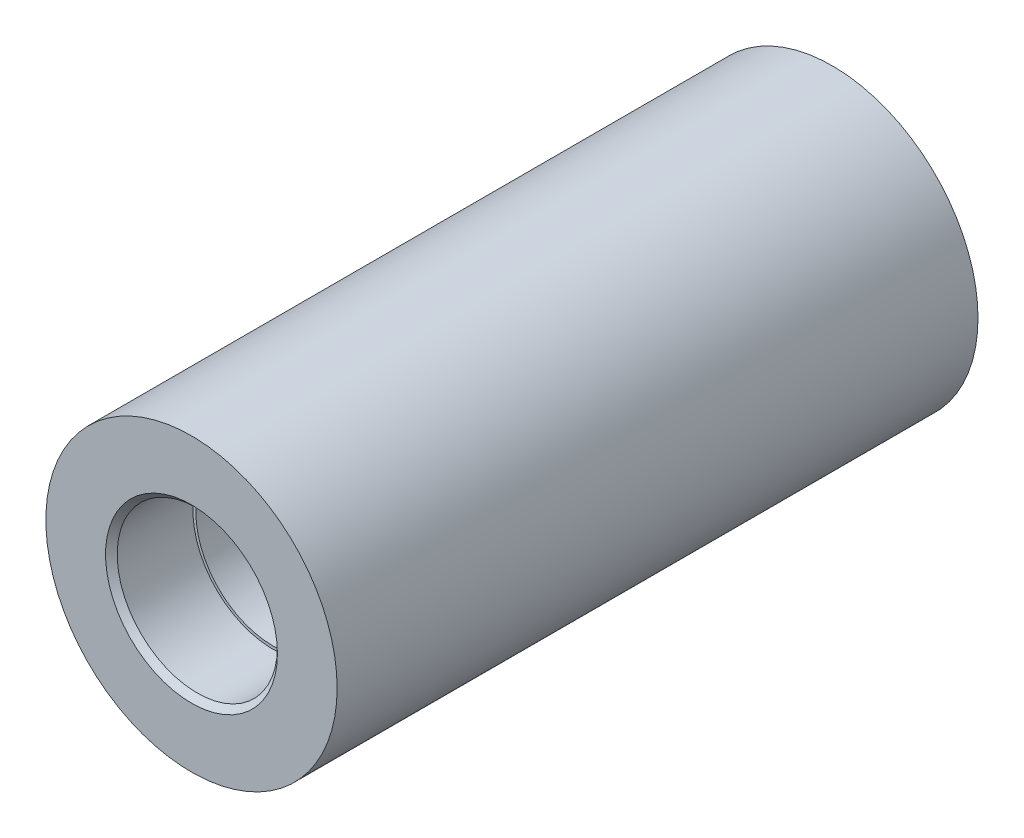
ISO-10303-21;
HEADER;
FILE_DESCRIPTION(('STEP AP214'),'2;1');
FILE_NAME('part.step','',(''),(''),'','','');
FILE_SCHEMA(('AUTOMOTIVE_DESIGN { 1 0 10303 214 1 1 1 1 }'));
ENDSEC;
DATA;
#1=APPLICATION_CONTEXT('core data for automotive mechanical design processes');
#2=APPLICATION_PROTOCOL_DEFINITION('international standard','automotive_design',2000,#1);
#3=PRODUCT_CONTEXT('',#1,'mechanical');
#4=PRODUCT('Part','Part','',(#3));
#5=PRODUCT_RELATED_PRODUCT_CATEGORY('part','',(#4));
#6=PRODUCT_DEFINITION_FORMATION('','',#4);
#7=PRODUCT_DEFINITION_CONTEXT('part definition',#1,'design');
#8=PRODUCT_DEFINITION('design','',#6,#7);
#9=PRODUCT_DEFINITION_SHAPE('','',#8);
#10=(LENGTH_UNIT() NAMED_UNIT(*) SI_UNIT(.MILLI.,.METRE.));
#11=(NAMED_UNIT(*) PLANE_ANGLE_UNIT() SI_UNIT($,.RADIAN.));
#12=(NAMED_UNIT(*) SI_UNIT($,.STERADIAN.) SOLID_ANGLE_UNIT());
#13=UNCERTAINTY_MEASURE_WITH_UNIT(LENGTH_MEASURE(1.E-05),#10,'distance_accuracy_value','');
#14=(GEOMETRIC_REPRESENTATION_CONTEXT(3) GLOBAL_UNCERTAINTY_ASSIGNED_CONTEXT((#13)) GLOBAL_UNIT_ASSIGNED_CONTEXT((#10,
#11,#12)) REPRESENTATION_CONTEXT('',''));
#15=CARTESIAN_POINT('',(0.,0.,0.));
#16=DIRECTION('',(0.,0.,1.));
#17=DIRECTION('',(1.,0.,0.));
#18=AXIS2_PLACEMENT_3D('',#15,#16,#17);
#19=CARTESIAN_POINT('',(0.,0.,44.));
#20=DIRECTION('',(0.,0.,-1.));
#21=DIRECTION('',(-1.,0.,0.));
#22=AXIS2_PLACEMENT_3D('',#19,#20,#21);
#23=CYLINDRICAL_SURFACE('',#22,5.3);
#24=CARTESIAN_POINT('',(0.,0.,38.4));
#25=DIRECTION('',(0.,0.,1.));
#26=DIRECTION('',(1.,0.,0.));
#27=AXIS2_PLACEMENT_3D('',#24,#25,#26);
#28=CIRCLE('',#27,5.3);
#29=CARTESIAN_POINT('',(5.3,0.,38.4));
#30=VERTEX_POINT('',#29);
#31=EDGE_CURVE('E64',#30,#30,#28,.T.);
#32=ORIENTED_EDGE('',*,*,#31,.T.);
#33=EDGE_LOOP('',(#32));
#34=FACE_BOUND('',#33,.T.);
#35=CARTESIAN_POINT('',(0.,0.,5.6));
#36=DIRECTION('',(0.,0.,-1.));
#37=DIRECTION('',(-1.,0.,0.));
#38=AXIS2_PLACEMENT_3D('',#35,#36,#37);
#39=CIRCLE('',#38,5.3);
#40=CARTESIAN_POINT('',(-5.3,0.,5.6));
#41=VERTEX_POINT('',#40);
#42=EDGE_CURVE('E59',#41,#41,#39,.T.);
#43=ORIENTED_EDGE('',*,*,#42,.T.);
#44=EDGE_LOOP('',(#43));
#45=FACE_BOUND('',#44,.T.);
#46=ADVANCED_FACE('F37',(#34,#45),#23,.F.);
#47=CARTESIAN_POINT('',(0.,0.,44.));
#48=DIRECTION('',(0.,0.,1.));
#49=DIRECTION('',(1.,0.,0.));
#50=AXIS2_PLACEMENT_3D('',#47,#48,#49);
#51=PLANE('',#50);
#52=CARTESIAN_POINT('',(0.,0.,44.));
#53=DIRECTION('',(0.,0.,1.));
#54=DIRECTION('',(1.,0.,0.));
#55=AXIS2_PLACEMENT_3D('',#52,#53,#54);
#56=CIRCLE('',#55,5.9);
#57=CARTESIAN_POINT('',(5.9,0.,44.));
#58=VERTEX_POINT('',#57);
#59=EDGE_CURVE('E49',#58,#58,#56,.F.);
#60=ORIENTED_EDGE('',*,*,#59,.T.);
#61=EDGE_LOOP('',(#60));
#62=FACE_BOUND('',#61,.T.);
#63=CARTESIAN_POINT('',(0.,0.,44.));
#64=DIRECTION('',(0.,0.,1.));
#65=DIRECTION('',(1.,0.,0.));
#66=AXIS2_PLACEMENT_3D('',#63,#64,#65);
#67=CIRCLE('',#66,10.);
#68=CARTESIAN_POINT('',(10.,0.,44.));
#69=VERTEX_POINT('',#68);
#70=EDGE_CURVE('E58',#69,#69,#67,.T.);
#71=ORIENTED_EDGE('',*,*,#70,.T.);
#72=EDGE_LOOP('',(#71));
#73=FACE_BOUND('',#72,.T.);
#74=ADVANCED_FACE('F94',(#62,#73),#51,.T.);
#75=CARTESIAN_POINT('',(0.,0.,0.));
#76=DIRECTION('',(0.,0.,1.));
#77=DIRECTION('',(1.,0.,0.));
#78=AXIS2_PLACEMENT_3D('',#75,#76,#77);
#79=PLANE('',#78);
#80=CARTESIAN_POINT('',(0.,0.,0.));
#81=DIRECTION('',(0.,0.,1.));
#82=DIRECTION('',(1.,0.,0.));
#83=AXIS2_PLACEMENT_3D('',#80,#81,#82);
#84=CIRCLE('',#83,6.29499885579992);
#85=CARTESIAN_POINT('',(6.29499885579992,0.,0.));
#86=VERTEX_POINT('',#85);
#87=EDGE_CURVE('E10',#86,#86,#84,.T.);
#88=ORIENTED_EDGE('',*,*,#87,.T.);
#89=EDGE_LOOP('',(#88));
#90=FACE_BOUND('',#89,.T.);
#91=CARTESIAN_POINT('',(0.,0.,0.));
#92=DIRECTION('',(0.,0.,1.));
#93=DIRECTION('',(1.,0.,0.));
#94=AXIS2_PLACEMENT_3D('',#91,#92,#93);
#95=CIRCLE('',#94,10.);
#96=CARTESIAN_POINT('',(10.,0.,0.));
#97=VERTEX_POINT('',#96);
#98=EDGE_CURVE('E67',#97,#97,#95,.T.);
#99=ORIENTED_EDGE('',*,*,#98,.F.);
#100=EDGE_LOOP('',(#99));
#101=FACE_BOUND('',#100,.T.);
#102=ADVANCED_FACE('F100',(#90,#101),#79,.F.);
#103=CARTESIAN_POINT('',(0.,0.,44.));
#104=DIRECTION('',(0.,0.,-1.));
#105=DIRECTION('',(-1.,0.,0.));
#106=AXIS2_PLACEMENT_3D('',#103,#104,#105);
#107=CYLINDRICAL_SURFACE('',#106,10.);
#108=ORIENTED_EDGE('',*,*,#70,.F.);
#109=EDGE_LOOP('',(#108));
#110=FACE_BOUND('',#109,.T.);
#111=ORIENTED_EDGE('',*,*,#98,.T.);
#112=EDGE_LOOP('',(#111));
#113=FACE_BOUND('',#112,.T.);
#114=ADVANCED_FACE('F108',(#110,#113),#107,.T.);
#115=CARTESIAN_POINT('',(0.,0.,38.4));
#116=DIRECTION('',(0.,0.,1.));
#117=DIRECTION('',(1.,0.,0.));
#118=AXIS2_PLACEMENT_3D('',#115,#116,#117);
#119=CYLINDRICAL_SURFACE('',#118,5.5);
#120=CARTESIAN_POINT('',(0.,0.,43.6));
#121=DIRECTION('',(0.,0.,1.));
#122=DIRECTION('',(1.,0.,0.));
#123=AXIS2_PLACEMENT_3D('',#120,#121,#122);
#124=CIRCLE('',#123,5.5);
#125=CARTESIAN_POINT('',(5.5,0.,43.6));
#126=VERTEX_POINT('',#125);
#127=EDGE_CURVE('E53',#126,#126,#124,.T.);
#128=ORIENTED_EDGE('',*,*,#127,.T.);
#129=EDGE_LOOP('',(#128));
#130=FACE_BOUND('',#129,.T.);
#131=CARTESIAN_POINT('',(0.,0.,38.4));
#132=DIRECTION('',(0.,0.,1.));
#133=DIRECTION('',(1.,0.,0.));
#134=AXIS2_PLACEMENT_3D('',#131,#132,#133);
#135=CIRCLE('',#134,5.5);
#136=CARTESIAN_POINT('',(5.5,0.,38.4));
#137=VERTEX_POINT('',#136);
#138=EDGE_CURVE('E62',#137,#137,#135,.T.);
#139=ORIENTED_EDGE('',*,*,#138,.F.);
#140=EDGE_LOOP('',(#139));
#141=FACE_BOUND('',#140,.T.);
#142=ADVANCED_FACE('F90',(#130,#141),#119,.F.);
#143=CARTESIAN_POINT('',(0.,0.,38.4));
#144=DIRECTION('',(0.,0.,1.));
#145=DIRECTION('',(1.,0.,0.));
#146=AXIS2_PLACEMENT_3D('',#143,#144,#145);
#147=PLANE('',#146);
#148=ORIENTED_EDGE('',*,*,#31,.F.);
#149=EDGE_LOOP('',(#148));
#150=FACE_BOUND('',#149,.T.);
#151=ORIENTED_EDGE('',*,*,#138,.T.);
#152=EDGE_LOOP('',(#151));
#153=FACE_BOUND('',#152,.T.);
#154=ADVANCED_FACE('F81',(#150,#153),#147,.T.);
#155=CARTESIAN_POINT('',(0.,0.,5.6));
#156=DIRECTION('',(0.,0.,-1.));
#157=DIRECTION('',(-1.,0.,0.));
#158=AXIS2_PLACEMENT_3D('',#155,#156,#157);
#159=CYLINDRICAL_SURFACE('',#158,5.89499885579991);
#160=CARTESIAN_POINT('',(0.,0.,0.400000000000014));
#161=DIRECTION('',(0.,0.,1.));
#162=DIRECTION('',(1.,0.,0.));
#163=AXIS2_PLACEMENT_3D('',#160,#161,#162);
#164=CIRCLE('',#163,5.89499885579991);
#165=CARTESIAN_POINT('',(5.89499885579991,0.,0.400000000000014));
#166=VERTEX_POINT('',#165);
#167=EDGE_CURVE('E45',#166,#166,#164,.F.);
#168=ORIENTED_EDGE('',*,*,#167,.T.);
#169=EDGE_LOOP('',(#168));
#170=FACE_BOUND('',#169,.T.);
#171=CARTESIAN_POINT('',(0.,0.,5.6));
#172=DIRECTION('',(0.,0.,-1.));
#173=DIRECTION('',(-1.,0.,0.));
#174=AXIS2_PLACEMENT_3D('',#171,#172,#173);
#175=CIRCLE('',#174,5.89499885579991);
#176=CARTESIAN_POINT('',(-5.89499885579991,0.,5.6));
#177=VERTEX_POINT('',#176);
#178=EDGE_CURVE('E63',#177,#177,#175,.T.);
#179=ORIENTED_EDGE('',*,*,#178,.F.);
#180=EDGE_LOOP('',(#179));
#181=FACE_BOUND('',#180,.T.);
#182=ADVANCED_FACE('F79',(#170,#181),#159,.F.);
#183=CARTESIAN_POINT('',(0.,0.,5.6));
#184=DIRECTION('',(0.,0.,-1.));
#185=DIRECTION('',(-1.,0.,0.));
#186=AXIS2_PLACEMENT_3D('',#183,#184,#185);
#187=PLANE('',#186);
#188=ORIENTED_EDGE('',*,*,#42,.F.);
#189=EDGE_LOOP('',(#188));
#190=FACE_BOUND('',#189,.T.);
#191=ORIENTED_EDGE('',*,*,#178,.T.);
#192=EDGE_LOOP('',(#191));
#193=FACE_BOUND('',#192,.T.);
#194=ADVANCED_FACE('F77',(#190,#193),#187,.T.);
#195=CARTESIAN_POINT('',(0.,0.,43.6));
#196=DIRECTION('',(0.,0.,1.));
#197=DIRECTION('',(1.,0.,0.));
#198=AXIS2_PLACEMENT_3D('',#195,#196,#197);
#199=CONICAL_SURFACE('',#198,5.5,0.785398163397446);
#200=ORIENTED_EDGE('',*,*,#59,.F.);
#201=EDGE_LOOP('',(#200));
#202=FACE_BOUND('',#201,.T.);
#203=ORIENTED_EDGE('',*,*,#127,.F.);
#204=EDGE_LOOP('',(#203));
#205=FACE_BOUND('',#204,.T.);
#206=ADVANCED_FACE('F87',(#202,#205),#199,.F.);
#207=CARTESIAN_POINT('',(0.,0.,0.400000000000014));
#208=DIRECTION('',(0.,0.,-1.));
#209=DIRECTION('',(-1.,0.,0.));
#210=AXIS2_PLACEMENT_3D('',#207,#208,#209);
#211=CONICAL_SURFACE('',#210,5.89499885579991,0.78539816339744);
#212=ORIENTED_EDGE('',*,*,#87,.F.);
#213=EDGE_LOOP('',(#212));
#214=FACE_BOUND('',#213,.T.);
#215=ORIENTED_EDGE('',*,*,#167,.F.);
#216=EDGE_LOOP('',(#215));
#217=FACE_BOUND('',#216,.T.);
#218=ADVANCED_FACE('F40',(#214,#217),#211,.F.);
#219=CLOSED_SHELL('',(#46,#74,#102,#114,#142,#154,#182,#194,#206,#218));
#220=MANIFOLD_SOLID_BREP('B2',#219);
#221=ADVANCED_BREP_SHAPE_REPRESENTATION('',(#18,#220),#14);
#222=SHAPE_DEFINITION_REPRESENTATION(#9,#221);
ENDSEC;
END-ISO-10303-21;
